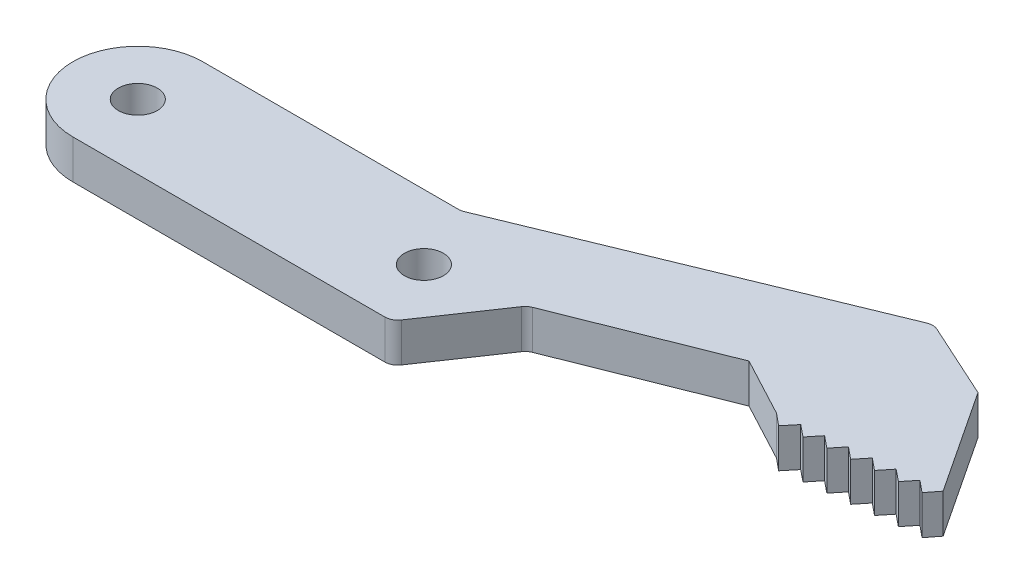
ISO-10303-21;
HEADER;
FILE_DESCRIPTION(('STEP AP214'),'2;1');
FILE_NAME('part.step','',(''),(''),'','','');
FILE_SCHEMA(('AUTOMOTIVE_DESIGN { 1 0 10303 214 1 1 1 1 }'));
ENDSEC;
DATA;
#1=APPLICATION_CONTEXT('core data for automotive mechanical design processes');
#2=APPLICATION_PROTOCOL_DEFINITION('international standard','automotive_design',2000,#1);
#3=PRODUCT_CONTEXT('',#1,'mechanical');
#4=PRODUCT('Part','Part','',(#3));
#5=PRODUCT_RELATED_PRODUCT_CATEGORY('part','',(#4));
#6=PRODUCT_DEFINITION_FORMATION('','',#4);
#7=PRODUCT_DEFINITION_CONTEXT('part definition',#1,'design');
#8=PRODUCT_DEFINITION('design','',#6,#7);
#9=PRODUCT_DEFINITION_SHAPE('','',#8);
#10=(LENGTH_UNIT() NAMED_UNIT(*) SI_UNIT(.MILLI.,.METRE.));
#11=(NAMED_UNIT(*) PLANE_ANGLE_UNIT() SI_UNIT($,.RADIAN.));
#12=(NAMED_UNIT(*) SI_UNIT($,.STERADIAN.) SOLID_ANGLE_UNIT());
#13=UNCERTAINTY_MEASURE_WITH_UNIT(LENGTH_MEASURE(1.E-05),#10,'distance_accuracy_value','');
#14=(GEOMETRIC_REPRESENTATION_CONTEXT(3) GLOBAL_UNCERTAINTY_ASSIGNED_CONTEXT((#13)) GLOBAL_UNIT_ASSIGNED_CONTEXT((#10,
#11,#12)) REPRESENTATION_CONTEXT('',''));
#15=CARTESIAN_POINT('',(0.,0.,0.));
#16=DIRECTION('',(0.,0.,1.));
#17=DIRECTION('',(1.,0.,0.));
#18=AXIS2_PLACEMENT_3D('',#15,#16,#17);
#19=CARTESIAN_POINT('',(29.3927079970185,3.,-0.393076672311641));
#20=DIRECTION('',(0.,-1.,0.));
#21=DIRECTION('',(0.,0.,-1.));
#22=AXIS2_PLACEMENT_3D('',#19,#20,#21);
#23=PLANE('',#22);
#24=CARTESIAN_POINT('',(29.3927079970185,3.,-0.393076672311641));
#25=DIRECTION('',(0.,-1.,0.));
#26=DIRECTION('',(0.,0.,-1.));
#27=AXIS2_PLACEMENT_3D('',#24,#25,#26);
#28=CIRCLE('',#27,1.);
#29=CARTESIAN_POINT('',(28.5649413257824,3.,-0.954149161381216));
#30=VERTEX_POINT('',#29);
#31=CARTESIAN_POINT('',(29.022312673,3.,-1.32195088551018));
#32=VERTEX_POINT('',#31);
#33=EDGE_CURVE('E305',#30,#32,#28,.T.);
#34=ORIENTED_EDGE('',*,*,#33,.T.);
#35=DIRECTION('',(0.92887421319854,0.,-0.370395324018532));
#36=VECTOR('',#35,1.);
#37=CARTESIAN_POINT('',(29.022312673,3.,-1.32195088551018));
#38=LINE('',#37,#36);
#39=CARTESIAN_POINT('',(40.9295532164884,3.,-6.07004934341117));
#40=VERTEX_POINT('',#39);
#41=EDGE_CURVE('E158',#32,#40,#38,.T.);
#42=ORIENTED_EDGE('',*,*,#41,.T.);
#43=DIRECTION('',(0.882520249063849,0.,0.470274398614556));
#44=VECTOR('',#43,1.);
#45=CARTESIAN_POINT('',(40.9295532164884,3.,-6.07004934341117));
#46=LINE('',#45,#44);
#47=CARTESIAN_POINT('',(45.4518423328041,3.,-3.66022724947906));
#48=VERTEX_POINT('',#47);
#49=EDGE_CURVE('E377',#40,#48,#46,.T.);
#50=ORIENTED_EDGE('',*,*,#49,.T.);
#51=DIRECTION('',(0.772498529134913,0.,0.635016552921572));
#52=VECTOR('',#51,1.);
#53=CARTESIAN_POINT('',(46.3790031104247,3.,-2.89807377111834));
#54=LINE('',#53,#52);
#55=CARTESIAN_POINT('',(46.3790031104247,3.,-2.89807377111834));
#56=VERTEX_POINT('',#55);
#57=EDGE_CURVE('E396',#48,#56,#54,.T.);
#58=ORIENTED_EDGE('',*,*,#57,.T.);
#59=DIRECTION('',(0.635016552921571,0.,-0.772498529134914));
#60=VECTOR('',#59,1.);
#61=CARTESIAN_POINT('',(47.1445862437582,3.,-3.82940672883367));
#62=LINE('',#61,#60);
#63=CARTESIAN_POINT('',(47.1445862437582,3.,-3.82940672883367));
#64=VERTEX_POINT('',#63);
#65=EDGE_CURVE('E393',#56,#64,#62,.T.);
#66=ORIENTED_EDGE('',*,*,#65,.T.);
#67=DIRECTION('',(0.777249081254573,0.,0.629193027368329));
#68=VECTOR('',#67,1.);
#69=CARTESIAN_POINT('',(47.1445862437582,3.,-3.82940672883367));
#70=LINE('',#69,#68);
#71=CARTESIAN_POINT('',(48.0617401596386,3.,-3.08695895653906));
#72=VERTEX_POINT('',#71);
#73=EDGE_CURVE('E395',#64,#72,#70,.T.);
#74=ORIENTED_EDGE('',*,*,#73,.T.);
#75=DIRECTION('',(0.629193027368274,0.,-0.777249081254617));
#76=VECTOR('',#75,1.);
#77=CARTESIAN_POINT('',(48.0617401596386,3.,-3.08695895653906));
#78=LINE('',#77,#76);
#79=CARTESIAN_POINT('',(48.8041879319331,3.,-4.0041128724195));
#80=VERTEX_POINT('',#79);
#81=EDGE_CURVE('E398',#72,#80,#78,.T.);
#82=ORIENTED_EDGE('',*,*,#81,.T.);
#83=DIRECTION('',(0.777249081254571,0.,0.629193027368331));
#84=VECTOR('',#83,1.);
#85=CARTESIAN_POINT('',(48.8041879319331,3.,-4.0041128724195));
#86=LINE('',#85,#84);
#87=CARTESIAN_POINT('',(49.7213418478135,3.,-3.26166510012487));
#88=VERTEX_POINT('',#87);
#89=EDGE_CURVE('E404',#80,#88,#86,.T.);
#90=ORIENTED_EDGE('',*,*,#89,.T.);
#91=DIRECTION('',(0.629193027368325,0.,-0.777249081254576));
#92=VECTOR('',#91,1.);
#93=CARTESIAN_POINT('',(49.7213418478135,3.,-3.26166510012487));
#94=LINE('',#93,#92);
#95=CARTESIAN_POINT('',(50.4637896201082,3.,-4.17881901600527));
#96=VERTEX_POINT('',#95);
#97=EDGE_CURVE('E406',#88,#96,#94,.T.);
#98=ORIENTED_EDGE('',*,*,#97,.T.);
#99=DIRECTION('',(0.777249081254573,0.,0.629193027368328));
#100=VECTOR('',#99,1.);
#101=CARTESIAN_POINT('',(50.4637896201082,3.,-4.17881901600527));
#102=LINE('',#101,#100);
#103=CARTESIAN_POINT('',(51.3809435359886,3.,-3.43637124371064));
#104=VERTEX_POINT('',#103);
#105=EDGE_CURVE('E408',#96,#104,#102,.T.);
#106=ORIENTED_EDGE('',*,*,#105,.T.);
#107=DIRECTION('',(0.629193027368325,0.,-0.777249081254576));
#108=VECTOR('',#107,1.);
#109=CARTESIAN_POINT('',(51.3809435359886,3.,-3.43637124371064));
#110=LINE('',#109,#108);
#111=CARTESIAN_POINT('',(52.1233913082832,3.,-4.35352515959104));
#112=VERTEX_POINT('',#111);
#113=EDGE_CURVE('E410',#104,#112,#110,.T.);
#114=ORIENTED_EDGE('',*,*,#113,.T.);
#115=DIRECTION('',(0.777249081254574,0.,0.629193027368328));
#116=VECTOR('',#115,1.);
#117=CARTESIAN_POINT('',(52.1233913082832,3.,-4.35352515959104));
#118=LINE('',#117,#116);
#119=CARTESIAN_POINT('',(53.0405452241636,3.,-3.61107738729642));
#120=VERTEX_POINT('',#119);
#121=EDGE_CURVE('E412',#112,#120,#118,.T.);
#122=ORIENTED_EDGE('',*,*,#121,.T.);
#123=DIRECTION('',(0.629193027368326,0.,-0.777249081254575));
#124=VECTOR('',#123,1.);
#125=CARTESIAN_POINT('',(53.0405452241636,3.,-3.61107738729642));
#126=LINE('',#125,#124);
#127=CARTESIAN_POINT('',(53.7829929964582,3.,-4.52823130317682));
#128=VERTEX_POINT('',#127);
#129=EDGE_CURVE('E414',#120,#128,#126,.T.);
#130=ORIENTED_EDGE('',*,*,#129,.T.);
#131=DIRECTION('',(0.777249081254571,0.,0.629193027368331));
#132=VECTOR('',#131,1.);
#133=CARTESIAN_POINT('',(53.7829929964582,3.,-4.52823130317682));
#134=LINE('',#133,#132);
#135=CARTESIAN_POINT('',(54.7001469123386,3.,-3.7857835308822));
#136=VERTEX_POINT('',#135);
#137=EDGE_CURVE('E416',#128,#136,#134,.T.);
#138=ORIENTED_EDGE('',*,*,#137,.T.);
#139=DIRECTION('',(0.629193027368277,0.,-0.777249081254614));
#140=VECTOR('',#139,1.);
#141=CARTESIAN_POINT('',(54.7001469123386,3.,-3.7857835308822));
#142=LINE('',#141,#140);
#143=CARTESIAN_POINT('',(55.4425946846332,3.,-4.70293744676264));
#144=VERTEX_POINT('',#143);
#145=EDGE_CURVE('E418',#136,#144,#142,.T.);
#146=ORIENTED_EDGE('',*,*,#145,.T.);
#147=DIRECTION('',(0.770917323577224,0.,0.636935224499736));
#148=VECTOR('',#147,1.);
#149=CARTESIAN_POINT('',(55.4425946846332,3.,-4.70293744676264));
#150=LINE('',#149,#148);
#151=CARTESIAN_POINT('',(56.3444850598045,3.,-3.95779172099483));
#152=VERTEX_POINT('',#151);
#153=EDGE_CURVE('E420',#144,#152,#150,.T.);
#154=ORIENTED_EDGE('',*,*,#153,.T.);
#155=DIRECTION('',(0.614706581439029,0.,-0.788755867639374));
#156=VECTOR('',#155,1.);
#157=CARTESIAN_POINT('',(56.3444850598045,3.,-3.95779172099483));
#158=LINE('',#157,#156);
#159=CARTESIAN_POINT('',(57.0543841098489,3.,-4.86869304865478));
#160=VERTEX_POINT('',#159);
#161=EDGE_CURVE('E422',#152,#160,#158,.T.);
#162=ORIENTED_EDGE('',*,*,#161,.T.);
#163=DIRECTION('',(-0.551215625590539,0.,-0.834362831210038));
#164=VECTOR('',#163,1.);
#165=CARTESIAN_POINT('',(51.8314021080849,3.,-12.7746047246566));
#166=LINE('',#165,#164);
#167=CARTESIAN_POINT('',(51.8314021080849,3.,-12.7746047246566));
#168=VERTEX_POINT('',#167);
#169=EDGE_CURVE('E424',#160,#168,#166,.T.);
#170=ORIENTED_EDGE('',*,*,#169,.T.);
#171=DIRECTION('',(-0.910033634641374,0.,-0.414534418138482));
#172=VECTOR('',#171,1.);
#173=CARTESIAN_POINT('',(46.0241839243038,3.,-15.4198825684427));
#174=LINE('',#173,#172);
#175=CARTESIAN_POINT('',(46.0241839243038,3.,-15.4198825684427));
#176=VERTEX_POINT('',#175);
#177=EDGE_CURVE('E426',#168,#176,#174,.T.);
#178=ORIENTED_EDGE('',*,*,#177,.T.);
#179=CARTESIAN_POINT('',(45.6096495061653,3.,-14.5098489338013));
#180=DIRECTION('',(0.,1.,0.));
#181=DIRECTION('',(0.,0.,-1.));
#182=AXIS2_PLACEMENT_3D('',#179,#180,#181);
#183=CIRCLE('',#182,1.);
#184=CARTESIAN_POINT('',(45.2293860934321,3.,-15.4347271619678));
#185=VERTEX_POINT('',#184);
#186=EDGE_CURVE('E428',#176,#185,#183,.T.);
#187=ORIENTED_EDGE('',*,*,#186,.T.);
#188=DIRECTION('',(-0.924878228166549,0.,0.380263412733207));
#189=VECTOR('',#188,1.);
#190=CARTESIAN_POINT('',(20.0327114807882,3.,-5.07512177183345));
#191=LINE('',#190,#189);
#192=CARTESIAN_POINT('',(20.0327114807882,3.,-5.07512177183345));
#193=VERTEX_POINT('',#192);
#194=EDGE_CURVE('E430',#185,#193,#191,.T.);
#195=ORIENTED_EDGE('',*,*,#194,.T.);
#196=CARTESIAN_POINT('',(19.652448068055,3.,-6.));
#197=DIRECTION('',(0.,-1.,0.));
#198=DIRECTION('',(0.,0.,1.));
#199=AXIS2_PLACEMENT_3D('',#196,#197,#198);
#200=CIRCLE('',#199,1.);
#201=CARTESIAN_POINT('',(19.652448068055,3.,-5.));
#202=VERTEX_POINT('',#201);
#203=EDGE_CURVE('E432',#193,#202,#200,.T.);
#204=ORIENTED_EDGE('',*,*,#203,.T.);
#205=DIRECTION('',(-1.,0.,0.));
#206=VECTOR('',#205,1.);
#207=CARTESIAN_POINT('',(0.,3.,-5.));
#208=LINE('',#207,#206);
#209=CARTESIAN_POINT('',(0.,3.,-5.));
#210=VERTEX_POINT('',#209);
#211=EDGE_CURVE('E434',#202,#210,#208,.T.);
#212=ORIENTED_EDGE('',*,*,#211,.T.);
#213=CARTESIAN_POINT('',(0.,3.,0.));
#214=DIRECTION('',(0.,1.,0.));
#215=DIRECTION('',(0.,0.,1.));
#216=AXIS2_PLACEMENT_3D('',#213,#214,#215);
#217=CIRCLE('',#216,5.);
#218=CARTESIAN_POINT('',(0.,3.,5.));
#219=VERTEX_POINT('',#218);
#220=EDGE_CURVE('E234',#210,#219,#217,.T.);
#221=ORIENTED_EDGE('',*,*,#220,.T.);
#222=DIRECTION('',(1.,0.,0.));
#223=VECTOR('',#222,1.);
#224=CARTESIAN_POINT('',(0.,3.,5.));
#225=LINE('',#224,#223);
#226=CARTESIAN_POINT('',(23.9988758721515,3.,5.));
#227=VERTEX_POINT('',#226);
#228=EDGE_CURVE('E228',#219,#227,#225,.T.);
#229=ORIENTED_EDGE('',*,*,#228,.T.);
#230=CARTESIAN_POINT('',(23.9988758721515,3.,4.));
#231=DIRECTION('',(0.,1.,0.));
#232=DIRECTION('',(0.,0.,1.));
#233=AXIS2_PLACEMENT_3D('',#230,#231,#232);
#234=CIRCLE('',#233,1.);
#235=CARTESIAN_POINT('',(24.8266425433876,3.,4.56107248906957));
#236=VERTEX_POINT('',#235);
#237=EDGE_CURVE('E232',#227,#236,#234,.T.);
#238=ORIENTED_EDGE('',*,*,#237,.T.);
#239=DIRECTION('',(0.561072489069578,0.,-0.827766671236085));
#240=VECTOR('',#239,1.);
#241=CARTESIAN_POINT('',(24.8266425433876,3.,4.56107248906957));
#242=LINE('',#241,#240);
#243=EDGE_CURVE('E58',#236,#30,#242,.T.);
#244=ORIENTED_EDGE('',*,*,#243,.T.);
#245=EDGE_LOOP('',(#34,#42,#50,#58,#66,#74,#82,#90,#98,#106,#114,#122,#130,#138,#146,#154,#162,
#170,#178,#187,#195,#204,#212,#221,#229,#238,#244));
#246=FACE_BOUND('',#245,.T.);
#247=CARTESIAN_POINT('',(0.,3.,0.));
#248=DIRECTION('',(0.,1.,0.));
#249=DIRECTION('',(0.,0.,1.));
#250=AXIS2_PLACEMENT_3D('',#247,#248,#249);
#251=CIRCLE('',#250,1.5);
#252=CARTESIAN_POINT('',(0.,3.,1.5));
#253=VERTEX_POINT('',#252);
#254=EDGE_CURVE('E256',#253,#253,#251,.T.);
#255=ORIENTED_EDGE('',*,*,#254,.F.);
#256=EDGE_LOOP('',(#255));
#257=FACE_BOUND('',#256,.T.);
#258=CARTESIAN_POINT('',(22.,3.,0.));
#259=DIRECTION('',(0.,1.,0.));
#260=DIRECTION('',(0.,0.,1.));
#261=AXIS2_PLACEMENT_3D('',#258,#259,#260);
#262=CIRCLE('',#261,1.5);
#263=CARTESIAN_POINT('',(22.,3.,1.5));
#264=VERTEX_POINT('',#263);
#265=EDGE_CURVE('E475',#264,#264,#262,.T.);
#266=ORIENTED_EDGE('',*,*,#265,.F.);
#267=EDGE_LOOP('',(#266));
#268=FACE_BOUND('',#267,.T.);
#269=ADVANCED_FACE('F41',(#246,#257,#268),#23,.F.);
#270=CARTESIAN_POINT('',(29.3927079970185,0.,-0.393076672311641));
#271=DIRECTION('',(0.,-1.,0.));
#272=DIRECTION('',(0.,0.,-1.));
#273=AXIS2_PLACEMENT_3D('',#270,#271,#272);
#274=PLANE('',#273);
#275=CARTESIAN_POINT('',(0.,0.,0.));
#276=DIRECTION('',(0.,1.,0.));
#277=DIRECTION('',(0.,0.,1.));
#278=AXIS2_PLACEMENT_3D('',#275,#276,#277);
#279=CIRCLE('',#278,1.5);
#280=CARTESIAN_POINT('',(0.,0.,1.5));
#281=VERTEX_POINT('',#280);
#282=EDGE_CURVE('E480',#281,#281,#279,.T.);
#283=ORIENTED_EDGE('',*,*,#282,.T.);
#284=EDGE_LOOP('',(#283));
#285=FACE_BOUND('',#284,.T.);
#286=CARTESIAN_POINT('',(29.3927079970185,0.,-0.393076672311641));
#287=DIRECTION('',(0.,-1.,0.));
#288=DIRECTION('',(0.,0.,-1.));
#289=AXIS2_PLACEMENT_3D('',#286,#287,#288);
#290=CIRCLE('',#289,1.);
#291=CARTESIAN_POINT('',(28.5649413257824,0.,-0.954149161381216));
#292=VERTEX_POINT('',#291);
#293=CARTESIAN_POINT('',(29.022312673,0.,-1.32195088551018));
#294=VERTEX_POINT('',#293);
#295=EDGE_CURVE('E252',#292,#294,#290,.T.);
#296=ORIENTED_EDGE('',*,*,#295,.F.);
#297=DIRECTION('',(0.561072489069578,0.,-0.827766671236085));
#298=VECTOR('',#297,1.);
#299=CARTESIAN_POINT('',(24.8266425433876,0.,4.56107248906957));
#300=LINE('',#299,#298);
#301=CARTESIAN_POINT('',(24.8266425433876,0.,4.56107248906957));
#302=VERTEX_POINT('',#301);
#303=EDGE_CURVE('E150',#302,#292,#300,.T.);
#304=ORIENTED_EDGE('',*,*,#303,.F.);
#305=CARTESIAN_POINT('',(23.9988758721515,0.,4.));
#306=DIRECTION('',(0.,1.,0.));
#307=DIRECTION('',(0.,0.,1.));
#308=AXIS2_PLACEMENT_3D('',#305,#306,#307);
#309=CIRCLE('',#308,1.);
#310=CARTESIAN_POINT('',(23.9988758721515,0.,5.));
#311=VERTEX_POINT('',#310);
#312=EDGE_CURVE('E144',#311,#302,#309,.T.);
#313=ORIENTED_EDGE('',*,*,#312,.F.);
#314=DIRECTION('',(1.,0.,0.));
#315=VECTOR('',#314,1.);
#316=CARTESIAN_POINT('',(0.,0.,5.));
#317=LINE('',#316,#315);
#318=CARTESIAN_POINT('',(0.,0.,5.));
#319=VERTEX_POINT('',#318);
#320=EDGE_CURVE('E242',#319,#311,#317,.T.);
#321=ORIENTED_EDGE('',*,*,#320,.F.);
#322=CARTESIAN_POINT('',(0.,0.,0.));
#323=DIRECTION('',(0.,1.,0.));
#324=DIRECTION('',(0.,0.,1.));
#325=AXIS2_PLACEMENT_3D('',#322,#323,#324);
#326=CIRCLE('',#325,5.);
#327=CARTESIAN_POINT('',(0.,0.,-5.));
#328=VERTEX_POINT('',#327);
#329=EDGE_CURVE('E300',#328,#319,#326,.T.);
#330=ORIENTED_EDGE('',*,*,#329,.F.);
#331=DIRECTION('',(-1.,0.,0.));
#332=VECTOR('',#331,1.);
#333=CARTESIAN_POINT('',(0.,0.,-5.));
#334=LINE('',#333,#332);
#335=CARTESIAN_POINT('',(19.652448068055,0.,-5.));
#336=VERTEX_POINT('',#335);
#337=EDGE_CURVE('E298',#336,#328,#334,.T.);
#338=ORIENTED_EDGE('',*,*,#337,.F.);
#339=CARTESIAN_POINT('',(19.652448068055,0.,-6.));
#340=DIRECTION('',(0.,-1.,0.));
#341=DIRECTION('',(0.,0.,1.));
#342=AXIS2_PLACEMENT_3D('',#339,#340,#341);
#343=CIRCLE('',#342,1.);
#344=CARTESIAN_POINT('',(20.0327114807882,0.,-5.07512177183345));
#345=VERTEX_POINT('',#344);
#346=EDGE_CURVE('E296',#345,#336,#343,.T.);
#347=ORIENTED_EDGE('',*,*,#346,.F.);
#348=DIRECTION('',(-0.924878228166549,0.,0.380263412733207));
#349=VECTOR('',#348,1.);
#350=CARTESIAN_POINT('',(20.0327114807882,0.,-5.07512177183345));
#351=LINE('',#350,#349);
#352=CARTESIAN_POINT('',(45.2293860934321,0.,-15.4347271619678));
#353=VERTEX_POINT('',#352);
#354=EDGE_CURVE('E294',#353,#345,#351,.T.);
#355=ORIENTED_EDGE('',*,*,#354,.F.);
#356=CARTESIAN_POINT('',(45.6096495061653,0.,-14.5098489338013));
#357=DIRECTION('',(0.,1.,0.));
#358=DIRECTION('',(0.,0.,-1.));
#359=AXIS2_PLACEMENT_3D('',#356,#357,#358);
#360=CIRCLE('',#359,1.);
#361=CARTESIAN_POINT('',(46.0241839243038,0.,-15.4198825684427));
#362=VERTEX_POINT('',#361);
#363=EDGE_CURVE('E292',#362,#353,#360,.T.);
#364=ORIENTED_EDGE('',*,*,#363,.F.);
#365=DIRECTION('',(-0.910033634641374,0.,-0.414534418138482));
#366=VECTOR('',#365,1.);
#367=CARTESIAN_POINT('',(46.0241839243038,0.,-15.4198825684427));
#368=LINE('',#367,#366);
#369=CARTESIAN_POINT('',(51.8314021080849,0.,-12.7746047246566));
#370=VERTEX_POINT('',#369);
#371=EDGE_CURVE('E290',#370,#362,#368,.T.);
#372=ORIENTED_EDGE('',*,*,#371,.F.);
#373=DIRECTION('',(-0.551215625590539,0.,-0.834362831210038));
#374=VECTOR('',#373,1.);
#375=CARTESIAN_POINT('',(51.8314021080849,0.,-12.7746047246566));
#376=LINE('',#375,#374);
#377=CARTESIAN_POINT('',(57.0543841098489,0.,-4.86869304865478));
#378=VERTEX_POINT('',#377);
#379=EDGE_CURVE('E288',#378,#370,#376,.T.);
#380=ORIENTED_EDGE('',*,*,#379,.F.);
#381=DIRECTION('',(0.614706581439029,0.,-0.788755867639374));
#382=VECTOR('',#381,1.);
#383=CARTESIAN_POINT('',(56.3444850598045,0.,-3.95779172099483));
#384=LINE('',#383,#382);
#385=CARTESIAN_POINT('',(56.3444850598045,0.,-3.95779172099483));
#386=VERTEX_POINT('',#385);
#387=EDGE_CURVE('E286',#386,#378,#384,.T.);
#388=ORIENTED_EDGE('',*,*,#387,.F.);
#389=DIRECTION('',(0.770917323577224,0.,0.636935224499736));
#390=VECTOR('',#389,1.);
#391=CARTESIAN_POINT('',(55.4425946846332,0.,-4.70293744676264));
#392=LINE('',#391,#390);
#393=CARTESIAN_POINT('',(55.4425946846332,0.,-4.70293744676264));
#394=VERTEX_POINT('',#393);
#395=EDGE_CURVE('E284',#394,#386,#392,.T.);
#396=ORIENTED_EDGE('',*,*,#395,.F.);
#397=DIRECTION('',(0.629193027368277,0.,-0.777249081254614));
#398=VECTOR('',#397,1.);
#399=CARTESIAN_POINT('',(54.7001469123386,0.,-3.7857835308822));
#400=LINE('',#399,#398);
#401=CARTESIAN_POINT('',(54.7001469123386,0.,-3.7857835308822));
#402=VERTEX_POINT('',#401);
#403=EDGE_CURVE('E282',#402,#394,#400,.T.);
#404=ORIENTED_EDGE('',*,*,#403,.F.);
#405=DIRECTION('',(0.777249081254571,0.,0.629193027368331));
#406=VECTOR('',#405,1.);
#407=CARTESIAN_POINT('',(53.7829929964582,0.,-4.52823130317682));
#408=LINE('',#407,#406);
#409=CARTESIAN_POINT('',(53.7829929964582,0.,-4.52823130317682));
#410=VERTEX_POINT('',#409);
#411=EDGE_CURVE('E280',#410,#402,#408,.T.);
#412=ORIENTED_EDGE('',*,*,#411,.F.);
#413=DIRECTION('',(0.629193027368326,0.,-0.777249081254575));
#414=VECTOR('',#413,1.);
#415=CARTESIAN_POINT('',(53.0405452241636,0.,-3.61107738729642));
#416=LINE('',#415,#414);
#417=CARTESIAN_POINT('',(53.0405452241636,0.,-3.61107738729642));
#418=VERTEX_POINT('',#417);
#419=EDGE_CURVE('E278',#418,#410,#416,.T.);
#420=ORIENTED_EDGE('',*,*,#419,.F.);
#421=DIRECTION('',(0.777249081254574,0.,0.629193027368328));
#422=VECTOR('',#421,1.);
#423=CARTESIAN_POINT('',(52.1233913082832,0.,-4.35352515959104));
#424=LINE('',#423,#422);
#425=CARTESIAN_POINT('',(52.1233913082832,0.,-4.35352515959104));
#426=VERTEX_POINT('',#425);
#427=EDGE_CURVE('E276',#426,#418,#424,.T.);
#428=ORIENTED_EDGE('',*,*,#427,.F.);
#429=DIRECTION('',(0.629193027368325,0.,-0.777249081254576));
#430=VECTOR('',#429,1.);
#431=CARTESIAN_POINT('',(51.3809435359886,0.,-3.43637124371064));
#432=LINE('',#431,#430);
#433=CARTESIAN_POINT('',(51.3809435359886,0.,-3.43637124371064));
#434=VERTEX_POINT('',#433);
#435=EDGE_CURVE('E274',#434,#426,#432,.T.);
#436=ORIENTED_EDGE('',*,*,#435,.F.);
#437=DIRECTION('',(0.777249081254573,0.,0.629193027368328));
#438=VECTOR('',#437,1.);
#439=CARTESIAN_POINT('',(50.4637896201082,0.,-4.17881901600527));
#440=LINE('',#439,#438);
#441=CARTESIAN_POINT('',(50.4637896201082,0.,-4.17881901600527));
#442=VERTEX_POINT('',#441);
#443=EDGE_CURVE('E272',#442,#434,#440,.T.);
#444=ORIENTED_EDGE('',*,*,#443,.F.);
#445=DIRECTION('',(0.629193027368325,0.,-0.777249081254576));
#446=VECTOR('',#445,1.);
#447=CARTESIAN_POINT('',(49.7213418478135,0.,-3.26166510012487));
#448=LINE('',#447,#446);
#449=CARTESIAN_POINT('',(49.7213418478135,0.,-3.26166510012487));
#450=VERTEX_POINT('',#449);
#451=EDGE_CURVE('E270',#450,#442,#448,.T.);
#452=ORIENTED_EDGE('',*,*,#451,.F.);
#453=DIRECTION('',(0.777249081254571,0.,0.629193027368331));
#454=VECTOR('',#453,1.);
#455=CARTESIAN_POINT('',(48.8041879319331,0.,-4.0041128724195));
#456=LINE('',#455,#454);
#457=CARTESIAN_POINT('',(48.8041879319331,0.,-4.0041128724195));
#458=VERTEX_POINT('',#457);
#459=EDGE_CURVE('E268',#458,#450,#456,.T.);
#460=ORIENTED_EDGE('',*,*,#459,.F.);
#461=DIRECTION('',(0.629193027368274,0.,-0.777249081254617));
#462=VECTOR('',#461,1.);
#463=CARTESIAN_POINT('',(48.0617401596386,0.,-3.08695895653906));
#464=LINE('',#463,#462);
#465=CARTESIAN_POINT('',(48.0617401596386,0.,-3.08695895653906));
#466=VERTEX_POINT('',#465);
#467=EDGE_CURVE('E266',#466,#458,#464,.T.);
#468=ORIENTED_EDGE('',*,*,#467,.F.);
#469=DIRECTION('',(0.777249081254573,0.,0.629193027368329));
#470=VECTOR('',#469,1.);
#471=CARTESIAN_POINT('',(47.1445862437582,0.,-3.82940672883367));
#472=LINE('',#471,#470);
#473=CARTESIAN_POINT('',(47.1445862437582,0.,-3.82940672883367));
#474=VERTEX_POINT('',#473);
#475=EDGE_CURVE('E264',#474,#466,#472,.T.);
#476=ORIENTED_EDGE('',*,*,#475,.F.);
#477=DIRECTION('',(0.635016552921571,0.,-0.772498529134914));
#478=VECTOR('',#477,1.);
#479=CARTESIAN_POINT('',(47.1445862437582,0.,-3.82940672883367));
#480=LINE('',#479,#478);
#481=CARTESIAN_POINT('',(46.3790031104247,0.,-2.89807377111834));
#482=VERTEX_POINT('',#481);
#483=EDGE_CURVE('E262',#482,#474,#480,.T.);
#484=ORIENTED_EDGE('',*,*,#483,.F.);
#485=DIRECTION('',(0.772498529134913,0.,0.635016552921572));
#486=VECTOR('',#485,1.);
#487=CARTESIAN_POINT('',(46.3790031104247,0.,-2.89807377111834));
#488=LINE('',#487,#486);
#489=CARTESIAN_POINT('',(45.4518423328041,0.,-3.66022724947906));
#490=VERTEX_POINT('',#489);
#491=EDGE_CURVE('E260',#490,#482,#488,.T.);
#492=ORIENTED_EDGE('',*,*,#491,.F.);
#493=DIRECTION('',(0.882520249063849,0.,0.470274398614556));
#494=VECTOR('',#493,1.);
#495=CARTESIAN_POINT('',(40.9295532164884,0.,-6.07004934341117));
#496=LINE('',#495,#494);
#497=CARTESIAN_POINT('',(40.9295532164884,0.,-6.07004934341117));
#498=VERTEX_POINT('',#497);
#499=EDGE_CURVE('E258',#498,#490,#496,.T.);
#500=ORIENTED_EDGE('',*,*,#499,.F.);
#501=DIRECTION('',(0.92887421319854,0.,-0.370395324018532));
#502=VECTOR('',#501,1.);
#503=CARTESIAN_POINT('',(29.022312673,0.,-1.32195088551018));
#504=LINE('',#503,#502);
#505=EDGE_CURVE('E255',#294,#498,#504,.T.);
#506=ORIENTED_EDGE('',*,*,#505,.F.);
#507=EDGE_LOOP('',(#296,#304,#313,#321,#330,#338,#347,#355,#364,#372,#380,#388,#396,#404,#412,
#420,#428,#436,#444,#452,#460,#468,#476,#484,#492,#500,#506));
#508=FACE_BOUND('',#507,.T.);
#509=CARTESIAN_POINT('',(22.,0.,0.));
#510=DIRECTION('',(0.,1.,0.));
#511=DIRECTION('',(0.,0.,1.));
#512=AXIS2_PLACEMENT_3D('',#509,#510,#511);
#513=CIRCLE('',#512,1.5);
#514=CARTESIAN_POINT('',(22.,0.,1.5));
#515=VERTEX_POINT('',#514);
#516=EDGE_CURVE('E478',#515,#515,#513,.T.);
#517=ORIENTED_EDGE('',*,*,#516,.T.);
#518=EDGE_LOOP('',(#517));
#519=FACE_BOUND('',#518,.T.);
#520=ADVANCED_FACE('F381',(#285,#508,#519),#274,.T.);
#521=CARTESIAN_POINT('',(29.3927079970185,3.,-0.393076672311641));
#522=DIRECTION('',(0.,-1.,0.));
#523=DIRECTION('',(0.,0.,-1.));
#524=AXIS2_PLACEMENT_3D('',#521,#522,#523);
#525=CYLINDRICAL_SURFACE('',#524,1.);
#526=ORIENTED_EDGE('',*,*,#295,.T.);
#527=DIRECTION('',(0.,-1.,0.));
#528=VECTOR('',#527,1.);
#529=CARTESIAN_POINT('',(29.022312673,3.,-1.32195088551018));
#530=LINE('',#529,#528);
#531=EDGE_CURVE('E11',#32,#294,#530,.T.);
#532=ORIENTED_EDGE('',*,*,#531,.F.);
#533=ORIENTED_EDGE('',*,*,#33,.F.);
#534=DIRECTION('',(0.,-1.,0.));
#535=VECTOR('',#534,1.);
#536=CARTESIAN_POINT('',(28.5649413257824,3.,-0.954149161381216));
#537=LINE('',#536,#535);
#538=EDGE_CURVE('E248',#30,#292,#537,.T.);
#539=ORIENTED_EDGE('',*,*,#538,.T.);
#540=EDGE_LOOP('',(#526,#532,#533,#539));
#541=FACE_BOUND('',#540,.T.);
#542=ADVANCED_FACE('F43',(#541),#525,.F.);
#543=CARTESIAN_POINT('',(29.022312673,3.,-1.32195088551018));
#544=DIRECTION('',(-0.370395324018532,0.,-0.92887421319854));
#545=DIRECTION('',(-0.92887421319854,0.,0.370395324018532));
#546=AXIS2_PLACEMENT_3D('',#543,#544,#545);
#547=PLANE('',#546);
#548=ORIENTED_EDGE('',*,*,#505,.T.);
#549=DIRECTION('',(0.,-1.,0.));
#550=VECTOR('',#549,1.);
#551=CARTESIAN_POINT('',(40.9295532164884,3.,-6.07004934341117));
#552=LINE('',#551,#550);
#553=EDGE_CURVE('E50',#40,#498,#552,.T.);
#554=ORIENTED_EDGE('',*,*,#553,.F.);
#555=ORIENTED_EDGE('',*,*,#41,.F.);
#556=ORIENTED_EDGE('',*,*,#531,.T.);
#557=EDGE_LOOP('',(#548,#554,#555,#556));
#558=FACE_BOUND('',#557,.T.);
#559=ADVANCED_FACE('F727',(#558),#547,.F.);
#560=CARTESIAN_POINT('',(40.9295532164884,3.,-6.07004934341117));
#561=DIRECTION('',(0.470274398614556,0.,-0.882520249063848));
#562=DIRECTION('',(-0.882520249063849,0.,-0.470274398614556));
#563=AXIS2_PLACEMENT_3D('',#560,#561,#562);
#564=PLANE('',#563);
#565=ORIENTED_EDGE('',*,*,#499,.T.);
#566=DIRECTION('',(0.,-1.,0.));
#567=VECTOR('',#566,1.);
#568=CARTESIAN_POINT('',(45.4518423328041,3.,-3.66022724947906));
#569=LINE('',#568,#567);
#570=EDGE_CURVE('E369',#48,#490,#569,.T.);
#571=ORIENTED_EDGE('',*,*,#570,.F.);
#572=ORIENTED_EDGE('',*,*,#49,.F.);
#573=ORIENTED_EDGE('',*,*,#553,.T.);
#574=EDGE_LOOP('',(#565,#571,#572,#573));
#575=FACE_BOUND('',#574,.T.);
#576=ADVANCED_FACE('F375',(#575),#564,.F.);
#577=CARTESIAN_POINT('',(46.3790031104247,3.,-2.89807377111834));
#578=DIRECTION('',(0.635016552921572,0.,-0.772498529134913));
#579=DIRECTION('',(-0.772498529134913,0.,-0.635016552921572));
#580=AXIS2_PLACEMENT_3D('',#577,#578,#579);
#581=PLANE('',#580);
#582=ORIENTED_EDGE('',*,*,#491,.T.);
#583=DIRECTION('',(0.,-1.,0.));
#584=VECTOR('',#583,1.);
#585=CARTESIAN_POINT('',(46.3790031104247,3.,-2.89807377111834));
#586=LINE('',#585,#584);
#587=EDGE_CURVE('E366',#56,#482,#586,.T.);
#588=ORIENTED_EDGE('',*,*,#587,.F.);
#589=ORIENTED_EDGE('',*,*,#57,.F.);
#590=ORIENTED_EDGE('',*,*,#570,.T.);
#591=EDGE_LOOP('',(#582,#588,#589,#590));
#592=FACE_BOUND('',#591,.T.);
#593=ADVANCED_FACE('F387',(#592),#581,.F.);
#594=CARTESIAN_POINT('',(47.1445862437582,3.,-3.82940672883367));
#595=DIRECTION('',(-0.772498529134914,0.,-0.635016552921571));
#596=DIRECTION('',(-0.635016552921571,0.,0.772498529134914));
#597=AXIS2_PLACEMENT_3D('',#594,#595,#596);
#598=PLANE('',#597);
#599=ORIENTED_EDGE('',*,*,#483,.T.);
#600=DIRECTION('',(0.,-1.,0.));
#601=VECTOR('',#600,1.);
#602=CARTESIAN_POINT('',(47.1445862437582,3.,-3.82940672883367));
#603=LINE('',#602,#601);
#604=EDGE_CURVE('E363',#64,#474,#603,.T.);
#605=ORIENTED_EDGE('',*,*,#604,.F.);
#606=ORIENTED_EDGE('',*,*,#65,.F.);
#607=ORIENTED_EDGE('',*,*,#587,.T.);
#608=EDGE_LOOP('',(#599,#605,#606,#607));
#609=FACE_BOUND('',#608,.T.);
#610=ADVANCED_FACE('F391',(#609),#598,.F.);
#611=CARTESIAN_POINT('',(47.1445862437582,3.,-3.82940672883367));
#612=DIRECTION('',(0.629193027368329,0.,-0.777249081254573));
#613=DIRECTION('',(-0.777249081254573,0.,-0.629193027368329));
#614=AXIS2_PLACEMENT_3D('',#611,#612,#613);
#615=PLANE('',#614);
#616=ORIENTED_EDGE('',*,*,#475,.T.);
#617=DIRECTION('',(0.,-1.,0.));
#618=VECTOR('',#617,1.);
#619=CARTESIAN_POINT('',(48.0617401596386,3.,-3.08695895653906));
#620=LINE('',#619,#618);
#621=EDGE_CURVE('E360',#72,#466,#620,.T.);
#622=ORIENTED_EDGE('',*,*,#621,.F.);
#623=ORIENTED_EDGE('',*,*,#73,.F.);
#624=ORIENTED_EDGE('',*,*,#604,.T.);
#625=EDGE_LOOP('',(#616,#622,#623,#624));
#626=FACE_BOUND('',#625,.T.);
#627=ADVANCED_FACE('F692',(#626),#615,.F.);
#628=CARTESIAN_POINT('',(48.0617401596386,3.,-3.08695895653906));
#629=DIRECTION('',(-0.777249081254617,0.,-0.629193027368274));
#630=DIRECTION('',(-0.629193027368274,0.,0.777249081254617));
#631=AXIS2_PLACEMENT_3D('',#628,#629,#630);
#632=PLANE('',#631);
#633=ORIENTED_EDGE('',*,*,#467,.T.);
#634=DIRECTION('',(0.,-1.,0.));
#635=VECTOR('',#634,1.);
#636=CARTESIAN_POINT('',(48.8041879319331,3.,-4.0041128724195));
#637=LINE('',#636,#635);
#638=EDGE_CURVE('E357',#80,#458,#637,.T.);
#639=ORIENTED_EDGE('',*,*,#638,.F.);
#640=ORIENTED_EDGE('',*,*,#81,.F.);
#641=ORIENTED_EDGE('',*,*,#621,.T.);
#642=EDGE_LOOP('',(#633,#639,#640,#641));
#643=FACE_BOUND('',#642,.T.);
#644=ADVANCED_FACE('F682',(#643),#632,.F.);
#645=CARTESIAN_POINT('',(48.8041879319331,3.,-4.0041128724195));
#646=DIRECTION('',(0.629193027368331,0.,-0.777249081254571));
#647=DIRECTION('',(-0.777249081254571,0.,-0.629193027368331));
#648=AXIS2_PLACEMENT_3D('',#645,#646,#647);
#649=PLANE('',#648);
#650=ORIENTED_EDGE('',*,*,#459,.T.);
#651=DIRECTION('',(0.,-1.,0.));
#652=VECTOR('',#651,1.);
#653=CARTESIAN_POINT('',(49.7213418478135,3.,-3.26166510012487));
#654=LINE('',#653,#652);
#655=EDGE_CURVE('E354',#88,#450,#654,.T.);
#656=ORIENTED_EDGE('',*,*,#655,.F.);
#657=ORIENTED_EDGE('',*,*,#89,.F.);
#658=ORIENTED_EDGE('',*,*,#638,.T.);
#659=EDGE_LOOP('',(#650,#656,#657,#658));
#660=FACE_BOUND('',#659,.T.);
#661=ADVANCED_FACE('F672',(#660),#649,.F.);
#662=CARTESIAN_POINT('',(49.7213418478135,3.,-3.26166510012487));
#663=DIRECTION('',(-0.777249081254576,0.,-0.629193027368325));
#664=DIRECTION('',(-0.629193027368325,0.,0.777249081254576));
#665=AXIS2_PLACEMENT_3D('',#662,#663,#664);
#666=PLANE('',#665);
#667=ORIENTED_EDGE('',*,*,#451,.T.);
#668=DIRECTION('',(0.,-1.,0.));
#669=VECTOR('',#668,1.);
#670=CARTESIAN_POINT('',(50.4637896201082,3.,-4.17881901600527));
#671=LINE('',#670,#669);
#672=EDGE_CURVE('E351',#96,#442,#671,.T.);
#673=ORIENTED_EDGE('',*,*,#672,.F.);
#674=ORIENTED_EDGE('',*,*,#97,.F.);
#675=ORIENTED_EDGE('',*,*,#655,.T.);
#676=EDGE_LOOP('',(#667,#673,#674,#675));
#677=FACE_BOUND('',#676,.T.);
#678=ADVANCED_FACE('F662',(#677),#666,.F.);
#679=CARTESIAN_POINT('',(50.4637896201082,3.,-4.17881901600527));
#680=DIRECTION('',(0.629193027368329,0.,-0.777249081254573));
#681=DIRECTION('',(-0.777249081254573,0.,-0.629193027368329));
#682=AXIS2_PLACEMENT_3D('',#679,#680,#681);
#683=PLANE('',#682);
#684=ORIENTED_EDGE('',*,*,#443,.T.);
#685=DIRECTION('',(0.,-1.,0.));
#686=VECTOR('',#685,1.);
#687=CARTESIAN_POINT('',(51.3809435359886,3.,-3.43637124371064));
#688=LINE('',#687,#686);
#689=EDGE_CURVE('E348',#104,#434,#688,.T.);
#690=ORIENTED_EDGE('',*,*,#689,.F.);
#691=ORIENTED_EDGE('',*,*,#105,.F.);
#692=ORIENTED_EDGE('',*,*,#672,.T.);
#693=EDGE_LOOP('',(#684,#690,#691,#692));
#694=FACE_BOUND('',#693,.T.);
#695=ADVANCED_FACE('F652',(#694),#683,.F.);
#696=CARTESIAN_POINT('',(51.3809435359886,3.,-3.43637124371064));
#697=DIRECTION('',(-0.777249081254576,0.,-0.629193027368325));
#698=DIRECTION('',(-0.629193027368325,0.,0.777249081254576));
#699=AXIS2_PLACEMENT_3D('',#696,#697,#698);
#700=PLANE('',#699);
#701=ORIENTED_EDGE('',*,*,#435,.T.);
#702=DIRECTION('',(0.,-1.,0.));
#703=VECTOR('',#702,1.);
#704=CARTESIAN_POINT('',(52.1233913082832,3.,-4.35352515959104));
#705=LINE('',#704,#703);
#706=EDGE_CURVE('E345',#112,#426,#705,.T.);
#707=ORIENTED_EDGE('',*,*,#706,.F.);
#708=ORIENTED_EDGE('',*,*,#113,.F.);
#709=ORIENTED_EDGE('',*,*,#689,.T.);
#710=EDGE_LOOP('',(#701,#707,#708,#709));
#711=FACE_BOUND('',#710,.T.);
#712=ADVANCED_FACE('F642',(#711),#700,.F.);
#713=CARTESIAN_POINT('',(52.1233913082832,3.,-4.35352515959104));
#714=DIRECTION('',(0.629193027368328,0.,-0.777249081254574));
#715=DIRECTION('',(-0.777249081254574,0.,-0.629193027368328));
#716=AXIS2_PLACEMENT_3D('',#713,#714,#715);
#717=PLANE('',#716);
#718=ORIENTED_EDGE('',*,*,#427,.T.);
#719=DIRECTION('',(0.,-1.,0.));
#720=VECTOR('',#719,1.);
#721=CARTESIAN_POINT('',(53.0405452241636,3.,-3.61107738729642));
#722=LINE('',#721,#720);
#723=EDGE_CURVE('E342',#120,#418,#722,.T.);
#724=ORIENTED_EDGE('',*,*,#723,.F.);
#725=ORIENTED_EDGE('',*,*,#121,.F.);
#726=ORIENTED_EDGE('',*,*,#706,.T.);
#727=EDGE_LOOP('',(#718,#724,#725,#726));
#728=FACE_BOUND('',#727,.T.);
#729=ADVANCED_FACE('F632',(#728),#717,.F.);
#730=CARTESIAN_POINT('',(53.0405452241636,3.,-3.61107738729642));
#731=DIRECTION('',(-0.777249081254575,0.,-0.629193027368326));
#732=DIRECTION('',(-0.629193027368326,0.,0.777249081254575));
#733=AXIS2_PLACEMENT_3D('',#730,#731,#732);
#734=PLANE('',#733);
#735=ORIENTED_EDGE('',*,*,#419,.T.);
#736=DIRECTION('',(0.,-1.,0.));
#737=VECTOR('',#736,1.);
#738=CARTESIAN_POINT('',(53.7829929964582,3.,-4.52823130317682));
#739=LINE('',#738,#737);
#740=EDGE_CURVE('E339',#128,#410,#739,.T.);
#741=ORIENTED_EDGE('',*,*,#740,.F.);
#742=ORIENTED_EDGE('',*,*,#129,.F.);
#743=ORIENTED_EDGE('',*,*,#723,.T.);
#744=EDGE_LOOP('',(#735,#741,#742,#743));
#745=FACE_BOUND('',#744,.T.);
#746=ADVANCED_FACE('F622',(#745),#734,.F.);
#747=CARTESIAN_POINT('',(53.7829929964582,3.,-4.52823130317682));
#748=DIRECTION('',(0.629193027368331,0.,-0.777249081254571));
#749=DIRECTION('',(-0.777249081254571,0.,-0.629193027368331));
#750=AXIS2_PLACEMENT_3D('',#747,#748,#749);
#751=PLANE('',#750);
#752=ORIENTED_EDGE('',*,*,#411,.T.);
#753=DIRECTION('',(0.,-1.,0.));
#754=VECTOR('',#753,1.);
#755=CARTESIAN_POINT('',(54.7001469123386,3.,-3.7857835308822));
#756=LINE('',#755,#754);
#757=EDGE_CURVE('E336',#136,#402,#756,.T.);
#758=ORIENTED_EDGE('',*,*,#757,.F.);
#759=ORIENTED_EDGE('',*,*,#137,.F.);
#760=ORIENTED_EDGE('',*,*,#740,.T.);
#761=EDGE_LOOP('',(#752,#758,#759,#760));
#762=FACE_BOUND('',#761,.T.);
#763=ADVANCED_FACE('F612',(#762),#751,.F.);
#764=CARTESIAN_POINT('',(54.7001469123386,3.,-3.7857835308822));
#765=DIRECTION('',(-0.777249081254614,0.,-0.629193027368278));
#766=DIRECTION('',(-0.629193027368278,0.,0.777249081254614));
#767=AXIS2_PLACEMENT_3D('',#764,#765,#766);
#768=PLANE('',#767);
#769=ORIENTED_EDGE('',*,*,#403,.T.);
#770=DIRECTION('',(0.,-1.,0.));
#771=VECTOR('',#770,1.);
#772=CARTESIAN_POINT('',(55.4425946846332,3.,-4.70293744676264));
#773=LINE('',#772,#771);
#774=EDGE_CURVE('E333',#144,#394,#773,.T.);
#775=ORIENTED_EDGE('',*,*,#774,.F.);
#776=ORIENTED_EDGE('',*,*,#145,.F.);
#777=ORIENTED_EDGE('',*,*,#757,.T.);
#778=EDGE_LOOP('',(#769,#775,#776,#777));
#779=FACE_BOUND('',#778,.T.);
#780=ADVANCED_FACE('F602',(#779),#768,.F.);
#781=CARTESIAN_POINT('',(55.4425946846332,3.,-4.70293744676264));
#782=DIRECTION('',(0.636935224499736,0.,-0.770917323577224));
#783=DIRECTION('',(-0.770917323577224,0.,-0.636935224499736));
#784=AXIS2_PLACEMENT_3D('',#781,#782,#783);
#785=PLANE('',#784);
#786=ORIENTED_EDGE('',*,*,#395,.T.);
#787=DIRECTION('',(0.,-1.,0.));
#788=VECTOR('',#787,1.);
#789=CARTESIAN_POINT('',(56.3444850598045,3.,-3.95779172099483));
#790=LINE('',#789,#788);
#791=EDGE_CURVE('E330',#152,#386,#790,.T.);
#792=ORIENTED_EDGE('',*,*,#791,.F.);
#793=ORIENTED_EDGE('',*,*,#153,.F.);
#794=ORIENTED_EDGE('',*,*,#774,.T.);
#795=EDGE_LOOP('',(#786,#792,#793,#794));
#796=FACE_BOUND('',#795,.T.);
#797=ADVANCED_FACE('F592',(#796),#785,.F.);
#798=CARTESIAN_POINT('',(56.3444850598045,3.,-3.95779172099483));
#799=DIRECTION('',(-0.788755867639374,0.,-0.614706581439029));
#800=DIRECTION('',(-0.614706581439029,0.,0.788755867639374));
#801=AXIS2_PLACEMENT_3D('',#798,#799,#800);
#802=PLANE('',#801);
#803=ORIENTED_EDGE('',*,*,#387,.T.);
#804=DIRECTION('',(0.,-1.,0.));
#805=VECTOR('',#804,1.);
#806=CARTESIAN_POINT('',(57.0543841098489,3.,-4.86869304865478));
#807=LINE('',#806,#805);
#808=EDGE_CURVE('E327',#160,#378,#807,.T.);
#809=ORIENTED_EDGE('',*,*,#808,.F.);
#810=ORIENTED_EDGE('',*,*,#161,.F.);
#811=ORIENTED_EDGE('',*,*,#791,.T.);
#812=EDGE_LOOP('',(#803,#809,#810,#811));
#813=FACE_BOUND('',#812,.T.);
#814=ADVANCED_FACE('F582',(#813),#802,.F.);
#815=CARTESIAN_POINT('',(51.8314021080849,3.,-12.7746047246566));
#816=DIRECTION('',(-0.834362831210038,0.,0.551215625590539));
#817=DIRECTION('',(0.551215625590539,0.,0.834362831210038));
#818=AXIS2_PLACEMENT_3D('',#815,#816,#817);
#819=PLANE('',#818);
#820=ORIENTED_EDGE('',*,*,#379,.T.);
#821=DIRECTION('',(0.,-1.,0.));
#822=VECTOR('',#821,1.);
#823=CARTESIAN_POINT('',(51.8314021080849,3.,-12.7746047246566));
#824=LINE('',#823,#822);
#825=EDGE_CURVE('E324',#168,#370,#824,.T.);
#826=ORIENTED_EDGE('',*,*,#825,.F.);
#827=ORIENTED_EDGE('',*,*,#169,.F.);
#828=ORIENTED_EDGE('',*,*,#808,.T.);
#829=EDGE_LOOP('',(#820,#826,#827,#828));
#830=FACE_BOUND('',#829,.T.);
#831=ADVANCED_FACE('F572',(#830),#819,.F.);
#832=CARTESIAN_POINT('',(46.0241839243038,3.,-15.4198825684427));
#833=DIRECTION('',(-0.414534418138482,0.,0.910033634641374));
#834=DIRECTION('',(0.910033634641374,0.,0.414534418138482));
#835=AXIS2_PLACEMENT_3D('',#832,#833,#834);
#836=PLANE('',#835);
#837=ORIENTED_EDGE('',*,*,#371,.T.);
#838=DIRECTION('',(0.,-1.,0.));
#839=VECTOR('',#838,1.);
#840=CARTESIAN_POINT('',(46.0241839243038,3.,-15.4198825684427));
#841=LINE('',#840,#839);
#842=EDGE_CURVE('E321',#176,#362,#841,.T.);
#843=ORIENTED_EDGE('',*,*,#842,.F.);
#844=ORIENTED_EDGE('',*,*,#177,.F.);
#845=ORIENTED_EDGE('',*,*,#825,.T.);
#846=EDGE_LOOP('',(#837,#843,#844,#845));
#847=FACE_BOUND('',#846,.T.);
#848=ADVANCED_FACE('F562',(#847),#836,.F.);
#849=CARTESIAN_POINT('',(45.6096495061653,3.,-14.5098489338013));
#850=DIRECTION('',(0.,-1.,0.));
#851=DIRECTION('',(0.,0.,-1.));
#852=AXIS2_PLACEMENT_3D('',#849,#850,#851);
#853=CYLINDRICAL_SURFACE('',#852,1.);
#854=ORIENTED_EDGE('',*,*,#363,.T.);
#855=DIRECTION('',(0.,-1.,0.));
#856=VECTOR('',#855,1.);
#857=CARTESIAN_POINT('',(45.2293860934321,3.,-15.4347271619678));
#858=LINE('',#857,#856);
#859=EDGE_CURVE('E318',#185,#353,#858,.T.);
#860=ORIENTED_EDGE('',*,*,#859,.F.);
#861=ORIENTED_EDGE('',*,*,#186,.F.);
#862=ORIENTED_EDGE('',*,*,#842,.T.);
#863=EDGE_LOOP('',(#854,#860,#861,#862));
#864=FACE_BOUND('',#863,.T.);
#865=ADVANCED_FACE('F552',(#864),#853,.T.);
#866=CARTESIAN_POINT('',(20.0327114807882,3.,-5.07512177183345));
#867=DIRECTION('',(0.380263412733207,0.,0.924878228166549));
#868=DIRECTION('',(0.924878228166549,0.,-0.380263412733207));
#869=AXIS2_PLACEMENT_3D('',#866,#867,#868);
#870=PLANE('',#869);
#871=ORIENTED_EDGE('',*,*,#354,.T.);
#872=DIRECTION('',(0.,-1.,0.));
#873=VECTOR('',#872,1.);
#874=CARTESIAN_POINT('',(20.0327114807882,3.,-5.07512177183345));
#875=LINE('',#874,#873);
#876=EDGE_CURVE('E315',#193,#345,#875,.T.);
#877=ORIENTED_EDGE('',*,*,#876,.F.);
#878=ORIENTED_EDGE('',*,*,#194,.F.);
#879=ORIENTED_EDGE('',*,*,#859,.T.);
#880=EDGE_LOOP('',(#871,#877,#878,#879));
#881=FACE_BOUND('',#880,.T.);
#882=ADVANCED_FACE('F542',(#881),#870,.F.);
#883=CARTESIAN_POINT('',(19.652448068055,3.,-6.));
#884=DIRECTION('',(0.,-1.,0.));
#885=DIRECTION('',(0.,0.,-1.));
#886=AXIS2_PLACEMENT_3D('',#883,#884,#885);
#887=CYLINDRICAL_SURFACE('',#886,1.);
#888=ORIENTED_EDGE('',*,*,#346,.T.);
#889=DIRECTION('',(0.,-1.,0.));
#890=VECTOR('',#889,1.);
#891=CARTESIAN_POINT('',(19.652448068055,3.,-5.));
#892=LINE('',#891,#890);
#893=EDGE_CURVE('E312',#202,#336,#892,.T.);
#894=ORIENTED_EDGE('',*,*,#893,.F.);
#895=ORIENTED_EDGE('',*,*,#203,.F.);
#896=ORIENTED_EDGE('',*,*,#876,.T.);
#897=EDGE_LOOP('',(#888,#894,#895,#896));
#898=FACE_BOUND('',#897,.T.);
#899=ADVANCED_FACE('F533',(#898),#887,.F.);
#900=CARTESIAN_POINT('',(0.,3.,-5.));
#901=DIRECTION('',(0.,0.,1.));
#902=DIRECTION('',(1.,0.,0.));
#903=AXIS2_PLACEMENT_3D('',#900,#901,#902);
#904=PLANE('',#903);
#905=ORIENTED_EDGE('',*,*,#337,.T.);
#906=DIRECTION('',(0.,-1.,0.));
#907=VECTOR('',#906,1.);
#908=CARTESIAN_POINT('',(0.,3.,-5.));
#909=LINE('',#908,#907);
#910=EDGE_CURVE('E309',#210,#328,#909,.T.);
#911=ORIENTED_EDGE('',*,*,#910,.F.);
#912=ORIENTED_EDGE('',*,*,#211,.F.);
#913=ORIENTED_EDGE('',*,*,#893,.T.);
#914=EDGE_LOOP('',(#905,#911,#912,#913));
#915=FACE_BOUND('',#914,.T.);
#916=ADVANCED_FACE('F440',(#915),#904,.F.);
#917=CARTESIAN_POINT('',(0.,3.,0.));
#918=DIRECTION('',(0.,-1.,0.));
#919=DIRECTION('',(0.,0.,-1.));
#920=AXIS2_PLACEMENT_3D('',#917,#918,#919);
#921=CYLINDRICAL_SURFACE('',#920,5.);
#922=ORIENTED_EDGE('',*,*,#329,.T.);
#923=DIRECTION('',(0.,-1.,0.));
#924=VECTOR('',#923,1.);
#925=CARTESIAN_POINT('',(0.,3.,5.));
#926=LINE('',#925,#924);
#927=EDGE_CURVE('E243',#219,#319,#926,.T.);
#928=ORIENTED_EDGE('',*,*,#927,.F.);
#929=ORIENTED_EDGE('',*,*,#220,.F.);
#930=ORIENTED_EDGE('',*,*,#910,.T.);
#931=EDGE_LOOP('',(#922,#928,#929,#930));
#932=FACE_BOUND('',#931,.T.);
#933=ADVANCED_FACE('F444',(#932),#921,.T.);
#934=CARTESIAN_POINT('',(0.,3.,5.));
#935=DIRECTION('',(0.,0.,-1.));
#936=DIRECTION('',(-1.,0.,0.));
#937=AXIS2_PLACEMENT_3D('',#934,#935,#936);
#938=PLANE('',#937);
#939=ORIENTED_EDGE('',*,*,#320,.T.);
#940=DIRECTION('',(0.,-1.,0.));
#941=VECTOR('',#940,1.);
#942=CARTESIAN_POINT('',(23.9988758721515,3.,5.));
#943=LINE('',#942,#941);
#944=EDGE_CURVE('E239',#227,#311,#943,.T.);
#945=ORIENTED_EDGE('',*,*,#944,.F.);
#946=ORIENTED_EDGE('',*,*,#228,.F.);
#947=ORIENTED_EDGE('',*,*,#927,.T.);
#948=EDGE_LOOP('',(#939,#945,#946,#947));
#949=FACE_BOUND('',#948,.T.);
#950=ADVANCED_FACE('F240',(#949),#938,.F.);
#951=CARTESIAN_POINT('',(23.9988758721515,3.,4.));
#952=DIRECTION('',(0.,-1.,0.));
#953=DIRECTION('',(0.,0.,-1.));
#954=AXIS2_PLACEMENT_3D('',#951,#952,#953);
#955=CYLINDRICAL_SURFACE('',#954,1.);
#956=ORIENTED_EDGE('',*,*,#312,.T.);
#957=DIRECTION('',(0.,-1.,0.));
#958=VECTOR('',#957,1.);
#959=CARTESIAN_POINT('',(24.8266425433876,3.,4.56107248906957));
#960=LINE('',#959,#958);
#961=EDGE_CURVE('E244',#236,#302,#960,.T.);
#962=ORIENTED_EDGE('',*,*,#961,.F.);
#963=ORIENTED_EDGE('',*,*,#237,.F.);
#964=ORIENTED_EDGE('',*,*,#944,.T.);
#965=EDGE_LOOP('',(#956,#962,#963,#964));
#966=FACE_BOUND('',#965,.T.);
#967=ADVANCED_FACE('F246',(#966),#955,.T.);
#968=CARTESIAN_POINT('',(24.8266425433876,3.,4.56107248906957));
#969=DIRECTION('',(-0.827766671236085,0.,-0.561072489069578));
#970=DIRECTION('',(-0.561072489069578,0.,0.827766671236085));
#971=AXIS2_PLACEMENT_3D('',#968,#969,#970);
#972=PLANE('',#971);
#973=ORIENTED_EDGE('',*,*,#303,.T.);
#974=ORIENTED_EDGE('',*,*,#538,.F.);
#975=ORIENTED_EDGE('',*,*,#243,.F.);
#976=ORIENTED_EDGE('',*,*,#961,.T.);
#977=EDGE_LOOP('',(#973,#974,#975,#976));
#978=FACE_BOUND('',#977,.T.);
#979=ADVANCED_FACE('F448',(#978),#972,.F.);
#980=CARTESIAN_POINT('',(0.,3.,0.));
#981=DIRECTION('',(0.,-1.,0.));
#982=DIRECTION('',(0.,0.,-1.));
#983=AXIS2_PLACEMENT_3D('',#980,#981,#982);
#984=CYLINDRICAL_SURFACE('',#983,1.5);
#985=ORIENTED_EDGE('',*,*,#254,.T.);
#986=EDGE_LOOP('',(#985));
#987=FACE_BOUND('',#986,.T.);
#988=ORIENTED_EDGE('',*,*,#282,.F.);
#989=EDGE_LOOP('',(#988));
#990=FACE_BOUND('',#989,.T.);
#991=ADVANCED_FACE('F450',(#987,#990),#984,.F.);
#992=CARTESIAN_POINT('',(22.,3.,0.));
#993=DIRECTION('',(0.,-1.,0.));
#994=DIRECTION('',(0.,0.,-1.));
#995=AXIS2_PLACEMENT_3D('',#992,#993,#994);
#996=CYLINDRICAL_SURFACE('',#995,1.5);
#997=ORIENTED_EDGE('',*,*,#265,.T.);
#998=EDGE_LOOP('',(#997));
#999=FACE_BOUND('',#998,.T.);
#1000=ORIENTED_EDGE('',*,*,#516,.F.);
#1001=EDGE_LOOP('',(#1000));
#1002=FACE_BOUND('',#1001,.T.);
#1003=ADVANCED_FACE('F456',(#999,#1002),#996,.F.);
#1004=CLOSED_SHELL('',(#269,#520,#542,#559,#576,#593,#610,#627,#644,#661,#678,#695,#712,#729,
#746,#763,#780,#797,#814,#831,#848,#865,#882,#899,#916,#933,#950,#967,#979,#991,#1003));
#1005=MANIFOLD_SOLID_BREP('B2',#1004);
#1006=ADVANCED_BREP_SHAPE_REPRESENTATION('',(#18,#1005),#14);
#1007=SHAPE_DEFINITION_REPRESENTATION(#9,#1006);
ENDSEC;
END-ISO-10303-21;
